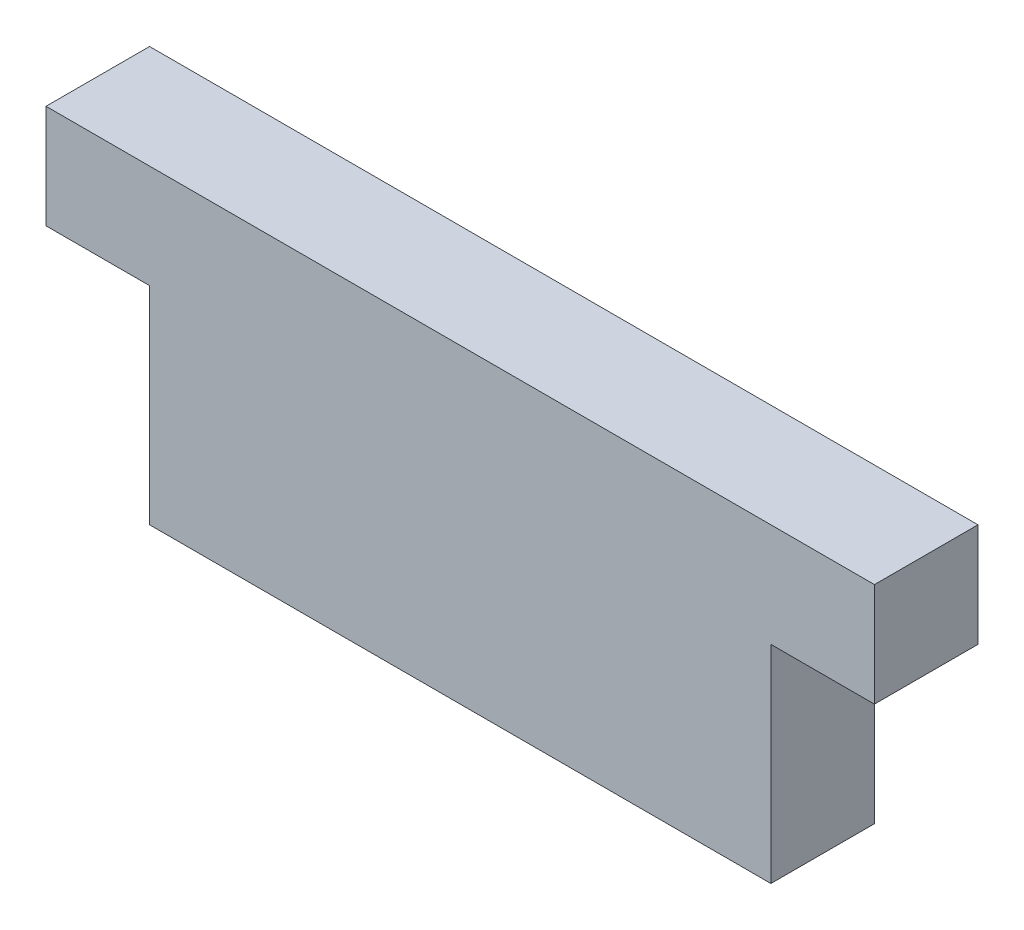
ISO-10303-21;
HEADER;
FILE_DESCRIPTION(('STEP AP214'),'2;1');
FILE_NAME('part.step','',(''),(''),'','','');
FILE_SCHEMA(('AUTOMOTIVE_DESIGN { 1 0 10303 214 1 1 1 1 }'));
ENDSEC;
DATA;
#1=APPLICATION_CONTEXT('core data for automotive mechanical design processes');
#2=APPLICATION_PROTOCOL_DEFINITION('international standard','automotive_design',2000,#1);
#3=PRODUCT_CONTEXT('',#1,'mechanical');
#4=PRODUCT('Part','Part','',(#3));
#5=PRODUCT_RELATED_PRODUCT_CATEGORY('part','',(#4));
#6=PRODUCT_DEFINITION_FORMATION('','',#4);
#7=PRODUCT_DEFINITION_CONTEXT('part definition',#1,'design');
#8=PRODUCT_DEFINITION('design','',#6,#7);
#9=PRODUCT_DEFINITION_SHAPE('','',#8);
#10=(LENGTH_UNIT() NAMED_UNIT(*) SI_UNIT(.MILLI.,.METRE.));
#11=(NAMED_UNIT(*) PLANE_ANGLE_UNIT() SI_UNIT($,.RADIAN.));
#12=(NAMED_UNIT(*) SI_UNIT($,.STERADIAN.) SOLID_ANGLE_UNIT());
#13=UNCERTAINTY_MEASURE_WITH_UNIT(LENGTH_MEASURE(1.E-05),#10,'distance_accuracy_value','');
#14=(GEOMETRIC_REPRESENTATION_CONTEXT(3) GLOBAL_UNCERTAINTY_ASSIGNED_CONTEXT((#13)) GLOBAL_UNIT_ASSIGNED_CONTEXT((#10,
#11,#12)) REPRESENTATION_CONTEXT('',''));
#15=CARTESIAN_POINT('',(0.,0.,0.));
#16=DIRECTION('',(0.,0.,1.));
#17=DIRECTION('',(1.,0.,0.));
#18=AXIS2_PLACEMENT_3D('',#15,#16,#17);
#19=CARTESIAN_POINT('',(0.,0.,5.));
#20=DIRECTION('',(1.,0.,0.));
#21=DIRECTION('',(0.,0.,-1.));
#22=AXIS2_PLACEMENT_3D('',#19,#20,#21);
#23=PLANE('',#22);
#24=DIRECTION('',(0.,-1.,0.));
#25=VECTOR('',#24,1.);
#26=CARTESIAN_POINT('',(0.,0.,0.));
#27=LINE('',#26,#25);
#28=CARTESIAN_POINT('',(0.,0.,0.));
#29=VERTEX_POINT('',#28);
#30=CARTESIAN_POINT('',(0.,-10.,0.));
#31=VERTEX_POINT('',#30);
#32=EDGE_CURVE('E130',#29,#31,#27,.T.);
#33=ORIENTED_EDGE('',*,*,#32,.F.);
#34=DIRECTION('',(0.,0.,-1.));
#35=VECTOR('',#34,1.);
#36=CARTESIAN_POINT('',(0.,0.,5.));
#37=LINE('',#36,#35);
#38=CARTESIAN_POINT('',(0.,0.,5.));
#39=VERTEX_POINT('',#38);
#40=EDGE_CURVE('E11',#39,#29,#37,.T.);
#41=ORIENTED_EDGE('',*,*,#40,.F.);
#42=DIRECTION('',(0.,-1.,0.));
#43=VECTOR('',#42,1.);
#44=CARTESIAN_POINT('',(0.,0.,5.));
#45=LINE('',#44,#43);
#46=CARTESIAN_POINT('',(0.,-10.,5.));
#47=VERTEX_POINT('',#46);
#48=EDGE_CURVE('E148',#39,#47,#45,.T.);
#49=ORIENTED_EDGE('',*,*,#48,.T.);
#50=DIRECTION('',(0.,0.,-1.));
#51=VECTOR('',#50,1.);
#52=CARTESIAN_POINT('',(0.,-10.,5.));
#53=LINE('',#52,#51);
#54=EDGE_CURVE('E50',#47,#31,#53,.T.);
#55=ORIENTED_EDGE('',*,*,#54,.T.);
#56=EDGE_LOOP('',(#33,#41,#49,#55));
#57=FACE_BOUND('',#56,.T.);
#58=ADVANCED_FACE('F34',(#57),#23,.T.);
#59=CARTESIAN_POINT('',(0.,0.,5.));
#60=DIRECTION('',(0.,1.,0.));
#61=DIRECTION('',(-1.,0.,0.));
#62=AXIS2_PLACEMENT_3D('',#59,#60,#61);
#63=PLANE('',#62);
#64=DIRECTION('',(1.,0.,0.));
#65=VECTOR('',#64,1.);
#66=CARTESIAN_POINT('',(0.,0.,0.));
#67=LINE('',#66,#65);
#68=CARTESIAN_POINT('',(5.,0.,0.));
#69=VERTEX_POINT('',#68);
#70=EDGE_CURVE('E132',#29,#69,#67,.T.);
#71=ORIENTED_EDGE('',*,*,#70,.T.);
#72=DIRECTION('',(0.,0.,-1.));
#73=VECTOR('',#72,1.);
#74=CARTESIAN_POINT('',(5.,0.,5.));
#75=LINE('',#74,#73);
#76=CARTESIAN_POINT('',(5.,0.,5.));
#77=VERTEX_POINT('',#76);
#78=EDGE_CURVE('E42',#77,#69,#75,.T.);
#79=ORIENTED_EDGE('',*,*,#78,.F.);
#80=DIRECTION('',(1.,0.,0.));
#81=VECTOR('',#80,1.);
#82=CARTESIAN_POINT('',(0.,0.,5.));
#83=LINE('',#82,#81);
#84=EDGE_CURVE('E113',#39,#77,#83,.T.);
#85=ORIENTED_EDGE('',*,*,#84,.F.);
#86=ORIENTED_EDGE('',*,*,#40,.T.);
#87=EDGE_LOOP('',(#71,#79,#85,#86));
#88=FACE_BOUND('',#87,.T.);
#89=ADVANCED_FACE('F186',(#88),#63,.F.);
#90=CARTESIAN_POINT('',(5.,0.,5.));
#91=DIRECTION('',(-1.,0.,0.));
#92=DIRECTION('',(0.,0.,1.));
#93=AXIS2_PLACEMENT_3D('',#90,#91,#92);
#94=PLANE('',#93);
#95=DIRECTION('',(0.,1.,0.));
#96=VECTOR('',#95,1.);
#97=CARTESIAN_POINT('',(5.,0.,0.));
#98=LINE('',#97,#96);
#99=CARTESIAN_POINT('',(5.,4.99999999999999,0.));
#100=VERTEX_POINT('',#99);
#101=EDGE_CURVE('E134',#69,#100,#98,.T.);
#102=ORIENTED_EDGE('',*,*,#101,.T.);
#103=DIRECTION('',(0.,0.,-1.));
#104=VECTOR('',#103,1.);
#105=CARTESIAN_POINT('',(5.,4.99999999999999,5.));
#106=LINE('',#105,#104);
#107=CARTESIAN_POINT('',(5.,4.99999999999999,5.));
#108=VERTEX_POINT('',#107);
#109=EDGE_CURVE('E154',#108,#100,#106,.T.);
#110=ORIENTED_EDGE('',*,*,#109,.F.);
#111=DIRECTION('',(0.,1.,0.));
#112=VECTOR('',#111,1.);
#113=CARTESIAN_POINT('',(5.,0.,5.));
#114=LINE('',#113,#112);
#115=EDGE_CURVE('E162',#77,#108,#114,.T.);
#116=ORIENTED_EDGE('',*,*,#115,.F.);
#117=ORIENTED_EDGE('',*,*,#78,.T.);
#118=EDGE_LOOP('',(#102,#110,#116,#117));
#119=FACE_BOUND('',#118,.T.);
#120=ADVANCED_FACE('F160',(#119),#94,.F.);
#121=CARTESIAN_POINT('',(0.,4.99999999999999,5.));
#122=DIRECTION('',(0.,1.,0.));
#123=DIRECTION('',(-1.,0.,0.));
#124=AXIS2_PLACEMENT_3D('',#121,#122,#123);
#125=PLANE('',#124);
#126=DIRECTION('',(1.,0.,0.));
#127=VECTOR('',#126,1.);
#128=CARTESIAN_POINT('',(0.,4.99999999999999,0.));
#129=LINE('',#128,#127);
#130=CARTESIAN_POINT('',(-35.,4.99999999999999,0.));
#131=VERTEX_POINT('',#130);
#132=EDGE_CURVE('E137',#131,#100,#129,.T.);
#133=ORIENTED_EDGE('',*,*,#132,.F.);
#134=DIRECTION('',(0.,0.,-1.));
#135=VECTOR('',#134,1.);
#136=CARTESIAN_POINT('',(-35.,4.99999999999999,5.));
#137=LINE('',#136,#135);
#138=CARTESIAN_POINT('',(-35.,4.99999999999999,5.));
#139=VERTEX_POINT('',#138);
#140=EDGE_CURVE('E152',#139,#131,#137,.T.);
#141=ORIENTED_EDGE('',*,*,#140,.F.);
#142=DIRECTION('',(1.,0.,0.));
#143=VECTOR('',#142,1.);
#144=CARTESIAN_POINT('',(0.,4.99999999999999,5.));
#145=LINE('',#144,#143);
#146=EDGE_CURVE('E172',#139,#108,#145,.T.);
#147=ORIENTED_EDGE('',*,*,#146,.T.);
#148=ORIENTED_EDGE('',*,*,#109,.T.);
#149=EDGE_LOOP('',(#133,#141,#147,#148));
#150=FACE_BOUND('',#149,.T.);
#151=ADVANCED_FACE('F170',(#150),#125,.T.);
#152=CARTESIAN_POINT('',(-35.,0.,5.));
#153=DIRECTION('',(-1.,0.,0.));
#154=DIRECTION('',(0.,0.,1.));
#155=AXIS2_PLACEMENT_3D('',#152,#153,#154);
#156=PLANE('',#155);
#157=DIRECTION('',(0.,1.,0.));
#158=VECTOR('',#157,1.);
#159=CARTESIAN_POINT('',(-35.,0.,0.));
#160=LINE('',#159,#158);
#161=CARTESIAN_POINT('',(-35.,0.,0.));
#162=VERTEX_POINT('',#161);
#163=EDGE_CURVE('E140',#162,#131,#160,.T.);
#164=ORIENTED_EDGE('',*,*,#163,.F.);
#165=DIRECTION('',(0.,0.,-1.));
#166=VECTOR('',#165,1.);
#167=CARTESIAN_POINT('',(-35.,0.,5.));
#168=LINE('',#167,#166);
#169=CARTESIAN_POINT('',(-35.,0.,5.));
#170=VERTEX_POINT('',#169);
#171=EDGE_CURVE('E121',#170,#162,#168,.T.);
#172=ORIENTED_EDGE('',*,*,#171,.F.);
#173=DIRECTION('',(0.,1.,0.));
#174=VECTOR('',#173,1.);
#175=CARTESIAN_POINT('',(-35.,0.,5.));
#176=LINE('',#175,#174);
#177=EDGE_CURVE('E110',#170,#139,#176,.T.);
#178=ORIENTED_EDGE('',*,*,#177,.T.);
#179=ORIENTED_EDGE('',*,*,#140,.T.);
#180=EDGE_LOOP('',(#164,#172,#178,#179));
#181=FACE_BOUND('',#180,.T.);
#182=ADVANCED_FACE('F196',(#181),#156,.T.);
#183=CARTESIAN_POINT('',(-30.,0.,0.));
#184=VERTEX_POINT('',#183);
#185=EDGE_CURVE('E118',#162,#184,#67,.T.);
#186=ORIENTED_EDGE('',*,*,#185,.T.);
#187=DIRECTION('',(0.,0.,-1.));
#188=VECTOR('',#187,1.);
#189=CARTESIAN_POINT('',(-30.,0.,5.));
#190=LINE('',#189,#188);
#191=CARTESIAN_POINT('',(-30.,0.,5.));
#192=VERTEX_POINT('',#191);
#193=EDGE_CURVE('E115',#192,#184,#190,.T.);
#194=ORIENTED_EDGE('',*,*,#193,.F.);
#195=EDGE_CURVE('E101',#170,#192,#83,.T.);
#196=ORIENTED_EDGE('',*,*,#195,.F.);
#197=ORIENTED_EDGE('',*,*,#171,.T.);
#198=EDGE_LOOP('',(#186,#194,#196,#197));
#199=FACE_BOUND('',#198,.T.);
#200=ADVANCED_FACE('F116',(#199),#63,.F.);
#201=CARTESIAN_POINT('',(-30.,0.,5.));
#202=DIRECTION('',(1.,0.,0.));
#203=DIRECTION('',(0.,1.,0.));
#204=AXIS2_PLACEMENT_3D('',#201,#202,#203);
#205=PLANE('',#204);
#206=DIRECTION('',(0.,-1.,0.));
#207=VECTOR('',#206,1.);
#208=CARTESIAN_POINT('',(-30.,0.,0.));
#209=LINE('',#208,#207);
#210=CARTESIAN_POINT('',(-30.,-10.,0.));
#211=VERTEX_POINT('',#210);
#212=EDGE_CURVE('E143',#184,#211,#209,.T.);
#213=ORIENTED_EDGE('',*,*,#212,.T.);
#214=DIRECTION('',(0.,0.,-1.));
#215=VECTOR('',#214,1.);
#216=CARTESIAN_POINT('',(-30.,-10.,5.));
#217=LINE('',#216,#215);
#218=CARTESIAN_POINT('',(-30.,-10.,5.));
#219=VERTEX_POINT('',#218);
#220=EDGE_CURVE('E76',#219,#211,#217,.T.);
#221=ORIENTED_EDGE('',*,*,#220,.F.);
#222=DIRECTION('',(0.,-1.,0.));
#223=VECTOR('',#222,1.);
#224=CARTESIAN_POINT('',(-30.,0.,5.));
#225=LINE('',#224,#223);
#226=EDGE_CURVE('E107',#192,#219,#225,.T.);
#227=ORIENTED_EDGE('',*,*,#226,.F.);
#228=ORIENTED_EDGE('',*,*,#193,.T.);
#229=EDGE_LOOP('',(#213,#221,#227,#228));
#230=FACE_BOUND('',#229,.T.);
#231=ADVANCED_FACE('F123',(#230),#205,.F.);
#232=CARTESIAN_POINT('',(0.,-10.,5.));
#233=DIRECTION('',(0.,-1.,0.));
#234=DIRECTION('',(1.,0.,0.));
#235=AXIS2_PLACEMENT_3D('',#232,#233,#234);
#236=PLANE('',#235);
#237=DIRECTION('',(-1.,0.,0.));
#238=VECTOR('',#237,1.);
#239=CARTESIAN_POINT('',(0.,-10.,0.));
#240=LINE('',#239,#238);
#241=EDGE_CURVE('E145',#31,#211,#240,.T.);
#242=ORIENTED_EDGE('',*,*,#241,.F.);
#243=ORIENTED_EDGE('',*,*,#54,.F.);
#244=DIRECTION('',(-1.,0.,0.));
#245=VECTOR('',#244,1.);
#246=CARTESIAN_POINT('',(0.,-10.,5.));
#247=LINE('',#246,#245);
#248=EDGE_CURVE('E124',#47,#219,#247,.T.);
#249=ORIENTED_EDGE('',*,*,#248,.T.);
#250=ORIENTED_EDGE('',*,*,#220,.T.);
#251=EDGE_LOOP('',(#242,#243,#249,#250));
#252=FACE_BOUND('',#251,.T.);
#253=ADVANCED_FACE('F175',(#252),#236,.T.);
#254=CARTESIAN_POINT('',(0.,0.,5.));
#255=DIRECTION('',(0.,0.,1.));
#256=DIRECTION('',(1.,0.,0.));
#257=AXIS2_PLACEMENT_3D('',#254,#255,#256);
#258=PLANE('',#257);
#259=ORIENTED_EDGE('',*,*,#48,.F.);
#260=ORIENTED_EDGE('',*,*,#84,.T.);
#261=ORIENTED_EDGE('',*,*,#115,.T.);
#262=ORIENTED_EDGE('',*,*,#146,.F.);
#263=ORIENTED_EDGE('',*,*,#177,.F.);
#264=ORIENTED_EDGE('',*,*,#195,.T.);
#265=ORIENTED_EDGE('',*,*,#226,.T.);
#266=ORIENTED_EDGE('',*,*,#248,.F.);
#267=EDGE_LOOP('',(#259,#260,#261,#262,#263,#264,#265,#266));
#268=FACE_BOUND('',#267,.T.);
#269=ADVANCED_FACE('F104',(#268),#258,.T.);
#270=CARTESIAN_POINT('',(0.,0.,0.));
#271=DIRECTION('',(0.,0.,1.));
#272=DIRECTION('',(1.,0.,0.));
#273=AXIS2_PLACEMENT_3D('',#270,#271,#272);
#274=PLANE('',#273);
#275=ORIENTED_EDGE('',*,*,#32,.T.);
#276=ORIENTED_EDGE('',*,*,#241,.T.);
#277=ORIENTED_EDGE('',*,*,#212,.F.);
#278=ORIENTED_EDGE('',*,*,#185,.F.);
#279=ORIENTED_EDGE('',*,*,#163,.T.);
#280=ORIENTED_EDGE('',*,*,#132,.T.);
#281=ORIENTED_EDGE('',*,*,#101,.F.);
#282=ORIENTED_EDGE('',*,*,#70,.F.);
#283=EDGE_LOOP('',(#275,#276,#277,#278,#279,#280,#281,#282));
#284=FACE_BOUND('',#283,.T.);
#285=ADVANCED_FACE('F166',(#284),#274,.F.);
#286=CLOSED_SHELL('',(#58,#89,#120,#151,#182,#200,#231,#253,#269,#285));
#287=MANIFOLD_SOLID_BREP('B2',#286);
#288=ADVANCED_BREP_SHAPE_REPRESENTATION('',(#18,#287),#14);
#289=SHAPE_DEFINITION_REPRESENTATION(#9,#288);
ENDSEC;
END-ISO-10303-21;
